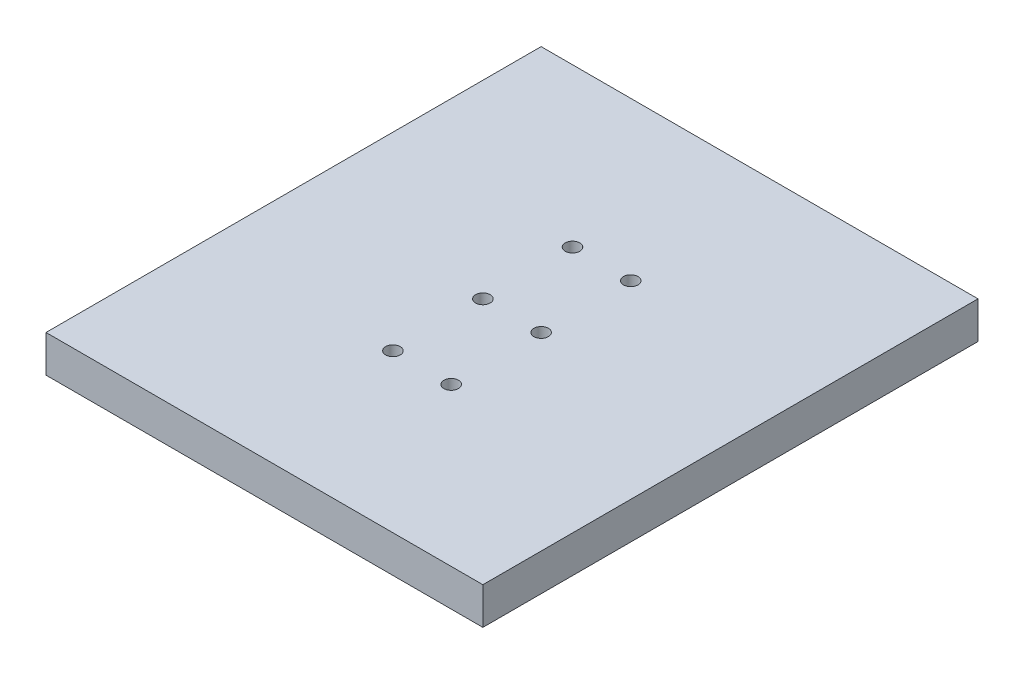
ISO-10303-21;
HEADER;
FILE_DESCRIPTION(('STEP AP214'),'2;1');
FILE_NAME('part.step','',(''),(''),'','','');
FILE_SCHEMA(('AUTOMOTIVE_DESIGN { 1 0 10303 214 1 1 1 1 }'));
ENDSEC;
DATA;
#1=APPLICATION_CONTEXT('core data for automotive mechanical design processes');
#2=APPLICATION_PROTOCOL_DEFINITION('international standard','automotive_design',2000,#1);
#3=PRODUCT_CONTEXT('',#1,'mechanical');
#4=PRODUCT('Part','Part','',(#3));
#5=PRODUCT_RELATED_PRODUCT_CATEGORY('part','',(#4));
#6=PRODUCT_DEFINITION_FORMATION('','',#4);
#7=PRODUCT_DEFINITION_CONTEXT('part definition',#1,'design');
#8=PRODUCT_DEFINITION('design','',#6,#7);
#9=PRODUCT_DEFINITION_SHAPE('','',#8);
#10=(LENGTH_UNIT() NAMED_UNIT(*) SI_UNIT(.MILLI.,.METRE.));
#11=(NAMED_UNIT(*) PLANE_ANGLE_UNIT() SI_UNIT($,.RADIAN.));
#12=(NAMED_UNIT(*) SI_UNIT($,.STERADIAN.) SOLID_ANGLE_UNIT());
#13=UNCERTAINTY_MEASURE_WITH_UNIT(LENGTH_MEASURE(1.E-05),#10,'distance_accuracy_value','');
#14=(GEOMETRIC_REPRESENTATION_CONTEXT(3) GLOBAL_UNCERTAINTY_ASSIGNED_CONTEXT((#13)) GLOBAL_UNIT_ASSIGNED_CONTEXT((#10,
#11,#12)) REPRESENTATION_CONTEXT('',''));
#15=CARTESIAN_POINT('',(0.,0.,0.));
#16=DIRECTION('',(0.,0.,1.));
#17=DIRECTION('',(1.,0.,0.));
#18=AXIS2_PLACEMENT_3D('',#15,#16,#17);
#19=CARTESIAN_POINT('',(0.,12.7,0.));
#20=DIRECTION('',(0.,1.,0.));
#21=DIRECTION('',(0.,0.,1.));
#22=AXIS2_PLACEMENT_3D('',#19,#20,#21);
#23=PLANE('',#22);
#24=CARTESIAN_POINT('',(10.,12.7,30.8842056676729));
#25=DIRECTION('',(0.,1.,0.));
#26=DIRECTION('',(0.,0.,1.));
#27=AXIS2_PLACEMENT_3D('',#24,#25,#26);
#28=CIRCLE('',#27,2.5);
#29=CARTESIAN_POINT('',(10.,12.7,33.3842056676729));
#30=VERTEX_POINT('',#29);
#31=EDGE_CURVE('E133',#30,#30,#28,.T.);
#32=ORIENTED_EDGE('',*,*,#31,.F.);
#33=EDGE_LOOP('',(#32));
#34=FACE_BOUND('',#33,.T.);
#35=CARTESIAN_POINT('',(10.,12.7,-30.7697897697997));
#36=DIRECTION('',(0.,1.,0.));
#37=DIRECTION('',(0.,0.,1.));
#38=AXIS2_PLACEMENT_3D('',#35,#36,#37);
#39=CIRCLE('',#38,2.5);
#40=CARTESIAN_POINT('',(10.,12.7,-28.2697897697997));
#41=VERTEX_POINT('',#40);
#42=EDGE_CURVE('E121',#41,#41,#39,.T.);
#43=ORIENTED_EDGE('',*,*,#42,.F.);
#44=EDGE_LOOP('',(#43));
#45=FACE_BOUND('',#44,.T.);
#46=CARTESIAN_POINT('',(10.,12.7,0.));
#47=DIRECTION('',(0.,1.,0.));
#48=DIRECTION('',(0.,0.,1.));
#49=AXIS2_PLACEMENT_3D('',#46,#47,#48);
#50=CIRCLE('',#49,2.50131003380069);
#51=CARTESIAN_POINT('',(10.,12.7,2.50131003380069));
#52=VERTEX_POINT('',#51);
#53=EDGE_CURVE('E100',#52,#52,#50,.T.);
#54=ORIENTED_EDGE('',*,*,#53,.F.);
#55=EDGE_LOOP('',(#54));
#56=FACE_BOUND('',#55,.T.);
#57=DIRECTION('',(0.,0.,1.));
#58=VECTOR('',#57,1.);
#59=CARTESIAN_POINT('',(-75.,12.7,85.));
#60=LINE('',#59,#58);
#61=CARTESIAN_POINT('',(-75.,12.7,-85.));
#62=VERTEX_POINT('',#61);
#63=CARTESIAN_POINT('',(-75.,12.7,85.));
#64=VERTEX_POINT('',#63);
#65=EDGE_CURVE('E85',#62,#64,#60,.T.);
#66=ORIENTED_EDGE('',*,*,#65,.T.);
#67=DIRECTION('',(1.,0.,0.));
#68=VECTOR('',#67,1.);
#69=CARTESIAN_POINT('',(75.,12.7,85.));
#70=LINE('',#69,#68);
#71=CARTESIAN_POINT('',(75.,12.7,85.));
#72=VERTEX_POINT('',#71);
#73=EDGE_CURVE('E80',#64,#72,#70,.T.);
#74=ORIENTED_EDGE('',*,*,#73,.T.);
#75=DIRECTION('',(0.,0.,-1.));
#76=VECTOR('',#75,1.);
#77=CARTESIAN_POINT('',(75.,12.7,85.));
#78=LINE('',#77,#76);
#79=CARTESIAN_POINT('',(75.,12.7,-85.));
#80=VERTEX_POINT('',#79);
#81=EDGE_CURVE('E83',#72,#80,#78,.T.);
#82=ORIENTED_EDGE('',*,*,#81,.T.);
#83=DIRECTION('',(-1.,0.,0.));
#84=VECTOR('',#83,1.);
#85=CARTESIAN_POINT('',(75.,12.7,-85.));
#86=LINE('',#85,#84);
#87=EDGE_CURVE('E50',#80,#62,#86,.T.);
#88=ORIENTED_EDGE('',*,*,#87,.T.);
#89=EDGE_LOOP('',(#66,#74,#82,#88));
#90=FACE_BOUND('',#89,.T.);
#91=CARTESIAN_POINT('',(-10.,12.7,0.));
#92=DIRECTION('',(0.,1.,0.));
#93=DIRECTION('',(0.,0.,1.));
#94=AXIS2_PLACEMENT_3D('',#91,#92,#93);
#95=CIRCLE('',#94,2.5);
#96=CARTESIAN_POINT('',(-10.,12.7,2.49999999999999));
#97=VERTEX_POINT('',#96);
#98=EDGE_CURVE('E115',#97,#97,#95,.T.);
#99=ORIENTED_EDGE('',*,*,#98,.F.);
#100=EDGE_LOOP('',(#99));
#101=FACE_BOUND('',#100,.T.);
#102=CARTESIAN_POINT('',(-10.,12.7,-30.7697897697997));
#103=DIRECTION('',(0.,1.,0.));
#104=DIRECTION('',(0.,0.,1.));
#105=AXIS2_PLACEMENT_3D('',#102,#103,#104);
#106=CIRCLE('',#105,2.5);
#107=CARTESIAN_POINT('',(-10.,12.7,-28.2697897697997));
#108=VERTEX_POINT('',#107);
#109=EDGE_CURVE('E127',#108,#108,#106,.T.);
#110=ORIENTED_EDGE('',*,*,#109,.F.);
#111=EDGE_LOOP('',(#110));
#112=FACE_BOUND('',#111,.T.);
#113=CARTESIAN_POINT('',(-9.99999999999999,12.7,30.8842056676729));
#114=DIRECTION('',(0.,1.,0.));
#115=DIRECTION('',(0.,0.,1.));
#116=AXIS2_PLACEMENT_3D('',#113,#114,#115);
#117=CIRCLE('',#116,2.5);
#118=CARTESIAN_POINT('',(-9.99999999999999,12.7,33.3842056676729));
#119=VERTEX_POINT('',#118);
#120=EDGE_CURVE('E139',#119,#119,#117,.T.);
#121=ORIENTED_EDGE('',*,*,#120,.F.);
#122=EDGE_LOOP('',(#121));
#123=FACE_BOUND('',#122,.T.);
#124=ADVANCED_FACE('F33',(#34,#45,#56,#90,#101,#112,#123),#23,.T.);
#125=CARTESIAN_POINT('',(0.,0.,0.));
#126=DIRECTION('',(0.,1.,0.));
#127=DIRECTION('',(0.,0.,1.));
#128=AXIS2_PLACEMENT_3D('',#125,#126,#127);
#129=PLANE('',#128);
#130=DIRECTION('',(0.,0.,1.));
#131=VECTOR('',#130,1.);
#132=CARTESIAN_POINT('',(-75.,0.,85.));
#133=LINE('',#132,#131);
#134=CARTESIAN_POINT('',(-75.,0.,-85.));
#135=VERTEX_POINT('',#134);
#136=CARTESIAN_POINT('',(-75.,0.,85.));
#137=VERTEX_POINT('',#136);
#138=EDGE_CURVE('E97',#135,#137,#133,.T.);
#139=ORIENTED_EDGE('',*,*,#138,.F.);
#140=DIRECTION('',(-1.,0.,0.));
#141=VECTOR('',#140,1.);
#142=CARTESIAN_POINT('',(75.,0.,-85.));
#143=LINE('',#142,#141);
#144=CARTESIAN_POINT('',(75.,0.,-85.));
#145=VERTEX_POINT('',#144);
#146=EDGE_CURVE('E73',#145,#135,#143,.T.);
#147=ORIENTED_EDGE('',*,*,#146,.F.);
#148=DIRECTION('',(0.,0.,-1.));
#149=VECTOR('',#148,1.);
#150=CARTESIAN_POINT('',(75.,0.,85.));
#151=LINE('',#150,#149);
#152=CARTESIAN_POINT('',(75.,0.,85.));
#153=VERTEX_POINT('',#152);
#154=EDGE_CURVE('E67',#153,#145,#151,.T.);
#155=ORIENTED_EDGE('',*,*,#154,.F.);
#156=DIRECTION('',(1.,0.,0.));
#157=VECTOR('',#156,1.);
#158=CARTESIAN_POINT('',(75.,0.,85.));
#159=LINE('',#158,#157);
#160=EDGE_CURVE('E89',#137,#153,#159,.T.);
#161=ORIENTED_EDGE('',*,*,#160,.F.);
#162=EDGE_LOOP('',(#139,#147,#155,#161));
#163=FACE_BOUND('',#162,.T.);
#164=CARTESIAN_POINT('',(10.,0.,0.));
#165=DIRECTION('',(0.,1.,0.));
#166=DIRECTION('',(0.,0.,1.));
#167=AXIS2_PLACEMENT_3D('',#164,#165,#166);
#168=CIRCLE('',#167,2.50131003380069);
#169=CARTESIAN_POINT('',(10.,0.,2.50131003380069));
#170=VERTEX_POINT('',#169);
#171=EDGE_CURVE('E112',#170,#170,#168,.T.);
#172=ORIENTED_EDGE('',*,*,#171,.T.);
#173=EDGE_LOOP('',(#172));
#174=FACE_BOUND('',#173,.T.);
#175=CARTESIAN_POINT('',(-10.,0.,0.));
#176=DIRECTION('',(0.,1.,0.));
#177=DIRECTION('',(0.,0.,1.));
#178=AXIS2_PLACEMENT_3D('',#175,#176,#177);
#179=CIRCLE('',#178,2.5);
#180=CARTESIAN_POINT('',(-10.,0.,2.49999999999999));
#181=VERTEX_POINT('',#180);
#182=EDGE_CURVE('E118',#181,#181,#179,.T.);
#183=ORIENTED_EDGE('',*,*,#182,.T.);
#184=EDGE_LOOP('',(#183));
#185=FACE_BOUND('',#184,.T.);
#186=CARTESIAN_POINT('',(10.,0.,-30.7697897697997));
#187=DIRECTION('',(0.,1.,0.));
#188=DIRECTION('',(0.,0.,1.));
#189=AXIS2_PLACEMENT_3D('',#186,#187,#188);
#190=CIRCLE('',#189,2.5);
#191=CARTESIAN_POINT('',(10.,0.,-28.2697897697997));
#192=VERTEX_POINT('',#191);
#193=EDGE_CURVE('E124',#192,#192,#190,.T.);
#194=ORIENTED_EDGE('',*,*,#193,.T.);
#195=EDGE_LOOP('',(#194));
#196=FACE_BOUND('',#195,.T.);
#197=CARTESIAN_POINT('',(-10.,0.,-30.7697897697997));
#198=DIRECTION('',(0.,1.,0.));
#199=DIRECTION('',(0.,0.,1.));
#200=AXIS2_PLACEMENT_3D('',#197,#198,#199);
#201=CIRCLE('',#200,2.5);
#202=CARTESIAN_POINT('',(-10.,0.,-28.2697897697997));
#203=VERTEX_POINT('',#202);
#204=EDGE_CURVE('E130',#203,#203,#201,.T.);
#205=ORIENTED_EDGE('',*,*,#204,.T.);
#206=EDGE_LOOP('',(#205));
#207=FACE_BOUND('',#206,.T.);
#208=CARTESIAN_POINT('',(10.,0.,30.8842056676729));
#209=DIRECTION('',(0.,1.,0.));
#210=DIRECTION('',(0.,0.,1.));
#211=AXIS2_PLACEMENT_3D('',#208,#209,#210);
#212=CIRCLE('',#211,2.5);
#213=CARTESIAN_POINT('',(10.,0.,33.3842056676729));
#214=VERTEX_POINT('',#213);
#215=EDGE_CURVE('E136',#214,#214,#212,.T.);
#216=ORIENTED_EDGE('',*,*,#215,.T.);
#217=EDGE_LOOP('',(#216));
#218=FACE_BOUND('',#217,.T.);
#219=CARTESIAN_POINT('',(-9.99999999999999,0.,30.8842056676729));
#220=DIRECTION('',(0.,1.,0.));
#221=DIRECTION('',(0.,0.,1.));
#222=AXIS2_PLACEMENT_3D('',#219,#220,#221);
#223=CIRCLE('',#222,2.5);
#224=CARTESIAN_POINT('',(-9.99999999999999,0.,33.3842056676729));
#225=VERTEX_POINT('',#224);
#226=EDGE_CURVE('E142',#225,#225,#223,.T.);
#227=ORIENTED_EDGE('',*,*,#226,.T.);
#228=EDGE_LOOP('',(#227));
#229=FACE_BOUND('',#228,.T.);
#230=ADVANCED_FACE('F108',(#163,#174,#185,#196,#207,#218,#229),#129,.F.);
#231=CARTESIAN_POINT('',(-75.,12.7,85.));
#232=DIRECTION('',(1.,0.,0.));
#233=DIRECTION('',(0.,0.,-1.));
#234=AXIS2_PLACEMENT_3D('',#231,#232,#233);
#235=PLANE('',#234);
#236=ORIENTED_EDGE('',*,*,#138,.T.);
#237=DIRECTION('',(0.,-1.,0.));
#238=VECTOR('',#237,1.);
#239=CARTESIAN_POINT('',(-75.,12.7,85.));
#240=LINE('',#239,#238);
#241=EDGE_CURVE('E11',#64,#137,#240,.T.);
#242=ORIENTED_EDGE('',*,*,#241,.F.);
#243=ORIENTED_EDGE('',*,*,#65,.F.);
#244=DIRECTION('',(0.,-1.,0.));
#245=VECTOR('',#244,1.);
#246=CARTESIAN_POINT('',(-75.,12.7,-85.));
#247=LINE('',#246,#245);
#248=EDGE_CURVE('E93',#62,#135,#247,.T.);
#249=ORIENTED_EDGE('',*,*,#248,.T.);
#250=EDGE_LOOP('',(#236,#242,#243,#249));
#251=FACE_BOUND('',#250,.T.);
#252=ADVANCED_FACE('F35',(#251),#235,.F.);
#253=CARTESIAN_POINT('',(75.,12.7,85.));
#254=DIRECTION('',(0.,0.,-1.));
#255=DIRECTION('',(-1.,0.,0.));
#256=AXIS2_PLACEMENT_3D('',#253,#254,#255);
#257=PLANE('',#256);
#258=ORIENTED_EDGE('',*,*,#160,.T.);
#259=DIRECTION('',(0.,-1.,0.));
#260=VECTOR('',#259,1.);
#261=CARTESIAN_POINT('',(75.,12.7,85.));
#262=LINE('',#261,#260);
#263=EDGE_CURVE('E42',#72,#153,#262,.T.);
#264=ORIENTED_EDGE('',*,*,#263,.F.);
#265=ORIENTED_EDGE('',*,*,#73,.F.);
#266=ORIENTED_EDGE('',*,*,#241,.T.);
#267=EDGE_LOOP('',(#258,#264,#265,#266));
#268=FACE_BOUND('',#267,.T.);
#269=ADVANCED_FACE('F88',(#268),#257,.F.);
#270=CARTESIAN_POINT('',(75.,12.7,85.));
#271=DIRECTION('',(-1.,0.,0.));
#272=DIRECTION('',(0.,0.,1.));
#273=AXIS2_PLACEMENT_3D('',#270,#271,#272);
#274=PLANE('',#273);
#275=ORIENTED_EDGE('',*,*,#154,.T.);
#276=DIRECTION('',(0.,-1.,0.));
#277=VECTOR('',#276,1.);
#278=CARTESIAN_POINT('',(75.,12.7,-85.));
#279=LINE('',#278,#277);
#280=EDGE_CURVE('E90',#80,#145,#279,.T.);
#281=ORIENTED_EDGE('',*,*,#280,.F.);
#282=ORIENTED_EDGE('',*,*,#81,.F.);
#283=ORIENTED_EDGE('',*,*,#263,.T.);
#284=EDGE_LOOP('',(#275,#281,#282,#283));
#285=FACE_BOUND('',#284,.T.);
#286=ADVANCED_FACE('F91',(#285),#274,.F.);
#287=CARTESIAN_POINT('',(75.,12.7,-85.));
#288=DIRECTION('',(0.,0.,1.));
#289=DIRECTION('',(1.,0.,0.));
#290=AXIS2_PLACEMENT_3D('',#287,#288,#289);
#291=PLANE('',#290);
#292=ORIENTED_EDGE('',*,*,#146,.T.);
#293=ORIENTED_EDGE('',*,*,#248,.F.);
#294=ORIENTED_EDGE('',*,*,#87,.F.);
#295=ORIENTED_EDGE('',*,*,#280,.T.);
#296=EDGE_LOOP('',(#292,#293,#294,#295));
#297=FACE_BOUND('',#296,.T.);
#298=ADVANCED_FACE('F105',(#297),#291,.F.);
#299=CARTESIAN_POINT('',(10.,12.7,0.));
#300=DIRECTION('',(0.,-1.,0.));
#301=DIRECTION('',(0.,0.,-1.));
#302=AXIS2_PLACEMENT_3D('',#299,#300,#301);
#303=CYLINDRICAL_SURFACE('',#302,2.50131003380069);
#304=ORIENTED_EDGE('',*,*,#53,.T.);
#305=EDGE_LOOP('',(#304));
#306=FACE_BOUND('',#305,.T.);
#307=ORIENTED_EDGE('',*,*,#171,.F.);
#308=EDGE_LOOP('',(#307));
#309=FACE_BOUND('',#308,.T.);
#310=ADVANCED_FACE('F161',(#306,#309),#303,.F.);
#311=CARTESIAN_POINT('',(-10.,12.7,0.));
#312=DIRECTION('',(0.,-1.,0.));
#313=DIRECTION('',(0.,0.,-1.));
#314=AXIS2_PLACEMENT_3D('',#311,#312,#313);
#315=CYLINDRICAL_SURFACE('',#314,2.5);
#316=ORIENTED_EDGE('',*,*,#98,.T.);
#317=EDGE_LOOP('',(#316));
#318=FACE_BOUND('',#317,.T.);
#319=ORIENTED_EDGE('',*,*,#182,.F.);
#320=EDGE_LOOP('',(#319));
#321=FACE_BOUND('',#320,.T.);
#322=ADVANCED_FACE('F207',(#318,#321),#315,.F.);
#323=CARTESIAN_POINT('',(10.,12.7,-30.7697897697997));
#324=DIRECTION('',(0.,-1.,0.));
#325=DIRECTION('',(0.,0.,-1.));
#326=AXIS2_PLACEMENT_3D('',#323,#324,#325);
#327=CYLINDRICAL_SURFACE('',#326,2.5);
#328=ORIENTED_EDGE('',*,*,#42,.T.);
#329=EDGE_LOOP('',(#328));
#330=FACE_BOUND('',#329,.T.);
#331=ORIENTED_EDGE('',*,*,#193,.F.);
#332=EDGE_LOOP('',(#331));
#333=FACE_BOUND('',#332,.T.);
#334=ADVANCED_FACE('F215',(#330,#333),#327,.F.);
#335=CARTESIAN_POINT('',(-10.,12.7,-30.7697897697997));
#336=DIRECTION('',(0.,-1.,0.));
#337=DIRECTION('',(0.,0.,-1.));
#338=AXIS2_PLACEMENT_3D('',#335,#336,#337);
#339=CYLINDRICAL_SURFACE('',#338,2.5);
#340=ORIENTED_EDGE('',*,*,#109,.T.);
#341=EDGE_LOOP('',(#340));
#342=FACE_BOUND('',#341,.T.);
#343=ORIENTED_EDGE('',*,*,#204,.F.);
#344=EDGE_LOOP('',(#343));
#345=FACE_BOUND('',#344,.T.);
#346=ADVANCED_FACE('F223',(#342,#345),#339,.F.);
#347=CARTESIAN_POINT('',(10.,12.7,30.8842056676729));
#348=DIRECTION('',(0.,-1.,0.));
#349=DIRECTION('',(0.,0.,-1.));
#350=AXIS2_PLACEMENT_3D('',#347,#348,#349);
#351=CYLINDRICAL_SURFACE('',#350,2.5);
#352=ORIENTED_EDGE('',*,*,#31,.T.);
#353=EDGE_LOOP('',(#352));
#354=FACE_BOUND('',#353,.T.);
#355=ORIENTED_EDGE('',*,*,#215,.F.);
#356=EDGE_LOOP('',(#355));
#357=FACE_BOUND('',#356,.T.);
#358=ADVANCED_FACE('F232',(#354,#357),#351,.F.);
#359=CARTESIAN_POINT('',(-9.99999999999999,12.7,30.8842056676729));
#360=DIRECTION('',(0.,-1.,0.));
#361=DIRECTION('',(0.,0.,-1.));
#362=AXIS2_PLACEMENT_3D('',#359,#360,#361);
#363=CYLINDRICAL_SURFACE('',#362,2.5);
#364=ORIENTED_EDGE('',*,*,#120,.T.);
#365=EDGE_LOOP('',(#364));
#366=FACE_BOUND('',#365,.T.);
#367=ORIENTED_EDGE('',*,*,#226,.F.);
#368=EDGE_LOOP('',(#367));
#369=FACE_BOUND('',#368,.T.);
#370=ADVANCED_FACE('F148',(#366,#369),#363,.F.);
#371=CLOSED_SHELL('',(#124,#230,#252,#269,#286,#298,#310,#322,#334,#346,#358,#370));
#372=MANIFOLD_SOLID_BREP('B2',#371);
#373=ADVANCED_BREP_SHAPE_REPRESENTATION('',(#18,#372),#14);
#374=SHAPE_DEFINITION_REPRESENTATION(#9,#373);
ENDSEC;
END-ISO-10303-21;
